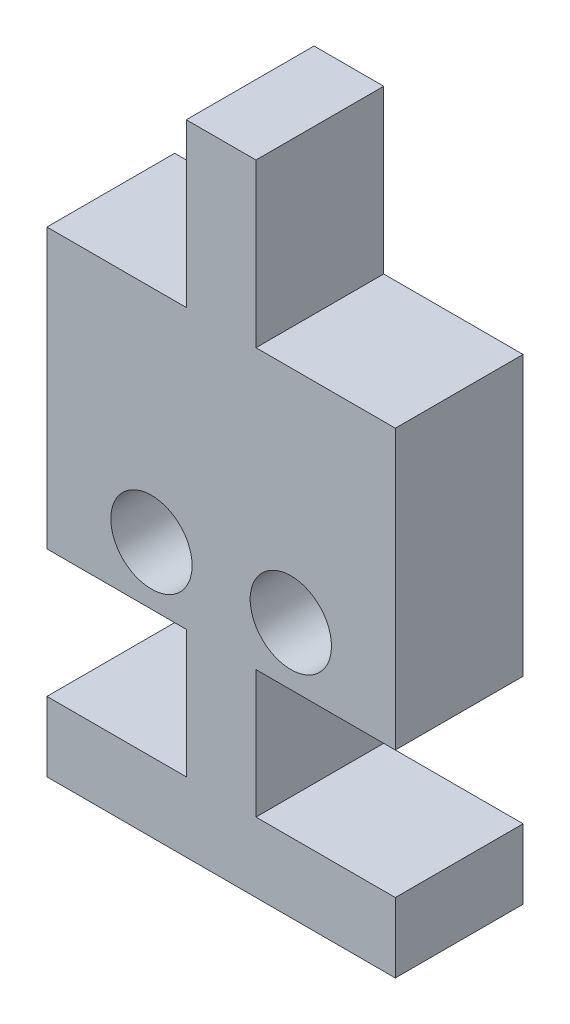
ISO-10303-21;
HEADER;
FILE_DESCRIPTION(('STEP AP214'),'2;1');
FILE_NAME('part.step','',(''),(''),'','','');
FILE_SCHEMA(('AUTOMOTIVE_DESIGN { 1 0 10303 214 1 1 1 1 }'));
ENDSEC;
DATA;
#1=APPLICATION_CONTEXT('core data for automotive mechanical design processes');
#2=APPLICATION_PROTOCOL_DEFINITION('international standard','automotive_design',2000,#1);
#3=PRODUCT_CONTEXT('',#1,'mechanical');
#4=PRODUCT('Part','Part','',(#3));
#5=PRODUCT_RELATED_PRODUCT_CATEGORY('part','',(#4));
#6=PRODUCT_DEFINITION_FORMATION('','',#4);
#7=PRODUCT_DEFINITION_CONTEXT('part definition',#1,'design');
#8=PRODUCT_DEFINITION('design','',#6,#7);
#9=PRODUCT_DEFINITION_SHAPE('','',#8);
#10=(LENGTH_UNIT() NAMED_UNIT(*) SI_UNIT(.MILLI.,.METRE.));
#11=(NAMED_UNIT(*) PLANE_ANGLE_UNIT() SI_UNIT($,.RADIAN.));
#12=(NAMED_UNIT(*) SI_UNIT($,.STERADIAN.) SOLID_ANGLE_UNIT());
#13=UNCERTAINTY_MEASURE_WITH_UNIT(LENGTH_MEASURE(1.E-05),#10,'distance_accuracy_value','');
#14=(GEOMETRIC_REPRESENTATION_CONTEXT(3) GLOBAL_UNCERTAINTY_ASSIGNED_CONTEXT((#13)) GLOBAL_UNIT_ASSIGNED_CONTEXT((#10,
#11,#12)) REPRESENTATION_CONTEXT('',''));
#15=CARTESIAN_POINT('',(0.,0.,0.));
#16=DIRECTION('',(0.,0.,1.));
#17=DIRECTION('',(1.,0.,0.));
#18=AXIS2_PLACEMENT_3D('',#15,#16,#17);
#19=CARTESIAN_POINT('',(-1.5,-6.99999999999999,5.5));
#20=DIRECTION('',(1.,0.,0.));
#21=DIRECTION('',(0.,1.,0.));
#22=AXIS2_PLACEMENT_3D('',#19,#20,#21);
#23=PLANE('',#22);
#24=DIRECTION('',(0.,-1.,0.));
#25=VECTOR('',#24,1.);
#26=CARTESIAN_POINT('',(-1.5,-6.99999999999999,0.));
#27=LINE('',#26,#25);
#28=CARTESIAN_POINT('',(-1.5,0.,0.));
#29=VERTEX_POINT('',#28);
#30=CARTESIAN_POINT('',(-1.5,-6.99999999999999,0.));
#31=VERTEX_POINT('',#30);
#32=EDGE_CURVE('E177',#29,#31,#27,.T.);
#33=ORIENTED_EDGE('',*,*,#32,.T.);
#34=DIRECTION('',(0.,0.,-1.));
#35=VECTOR('',#34,1.);
#36=CARTESIAN_POINT('',(-1.5,-6.99999999999999,5.5));
#37=LINE('',#36,#35);
#38=CARTESIAN_POINT('',(-1.5,-6.99999999999999,5.5));
#39=VERTEX_POINT('',#38);
#40=EDGE_CURVE('E11',#39,#31,#37,.T.);
#41=ORIENTED_EDGE('',*,*,#40,.F.);
#42=DIRECTION('',(0.,-1.,0.));
#43=VECTOR('',#42,1.);
#44=CARTESIAN_POINT('',(-1.5,-6.99999999999999,5.5));
#45=LINE('',#44,#43);
#46=CARTESIAN_POINT('',(-1.5,0.,5.5));
#47=VERTEX_POINT('',#46);
#48=EDGE_CURVE('E208',#47,#39,#45,.T.);
#49=ORIENTED_EDGE('',*,*,#48,.F.);
#50=DIRECTION('',(0.,0.,-1.));
#51=VECTOR('',#50,1.);
#52=CARTESIAN_POINT('',(-1.5,0.,5.5));
#53=LINE('',#52,#51);
#54=EDGE_CURVE('E173',#47,#29,#53,.T.);
#55=ORIENTED_EDGE('',*,*,#54,.T.);
#56=EDGE_LOOP('',(#33,#41,#49,#55));
#57=FACE_BOUND('',#56,.T.);
#58=ADVANCED_FACE('F33',(#57),#23,.F.);
#59=CARTESIAN_POINT('',(-7.5,-7.,5.5));
#60=DIRECTION('',(0.,-1.,0.));
#61=DIRECTION('',(1.,0.,0.));
#62=AXIS2_PLACEMENT_3D('',#59,#60,#61);
#63=PLANE('',#62);
#64=DIRECTION('',(-1.,0.,0.));
#65=VECTOR('',#64,1.);
#66=CARTESIAN_POINT('',(-7.5,-7.,0.));
#67=LINE('',#66,#65);
#68=CARTESIAN_POINT('',(-7.5,-7.,0.));
#69=VERTEX_POINT('',#68);
#70=EDGE_CURVE('E180',#31,#69,#67,.T.);
#71=ORIENTED_EDGE('',*,*,#70,.T.);
#72=DIRECTION('',(0.,0.,-1.));
#73=VECTOR('',#72,1.);
#74=CARTESIAN_POINT('',(-7.5,-7.,5.5));
#75=LINE('',#74,#73);
#76=CARTESIAN_POINT('',(-7.5,-7.,5.5));
#77=VERTEX_POINT('',#76);
#78=EDGE_CURVE('E41',#77,#69,#75,.T.);
#79=ORIENTED_EDGE('',*,*,#78,.F.);
#80=DIRECTION('',(-1.,0.,0.));
#81=VECTOR('',#80,1.);
#82=CARTESIAN_POINT('',(-7.5,-7.,5.5));
#83=LINE('',#82,#81);
#84=EDGE_CURVE('E116',#39,#77,#83,.T.);
#85=ORIENTED_EDGE('',*,*,#84,.F.);
#86=ORIENTED_EDGE('',*,*,#40,.T.);
#87=EDGE_LOOP('',(#71,#79,#85,#86));
#88=FACE_BOUND('',#87,.T.);
#89=ADVANCED_FACE('F308',(#88),#63,.F.);
#90=CARTESIAN_POINT('',(-7.5,-7.,5.5));
#91=DIRECTION('',(1.,0.,0.));
#92=DIRECTION('',(0.,1.,0.));
#93=AXIS2_PLACEMENT_3D('',#90,#91,#92);
#94=PLANE('',#93);
#95=DIRECTION('',(0.,-1.,0.));
#96=VECTOR('',#95,1.);
#97=CARTESIAN_POINT('',(-7.5,-7.,0.));
#98=LINE('',#97,#96);
#99=CARTESIAN_POINT('',(-7.5,-19.,0.));
#100=VERTEX_POINT('',#99);
#101=EDGE_CURVE('E183',#69,#100,#98,.T.);
#102=ORIENTED_EDGE('',*,*,#101,.T.);
#103=DIRECTION('',(0.,0.,-1.));
#104=VECTOR('',#103,1.);
#105=CARTESIAN_POINT('',(-7.5,-19.,5.5));
#106=LINE('',#105,#104);
#107=CARTESIAN_POINT('',(-7.5,-19.,5.5));
#108=VERTEX_POINT('',#107);
#109=EDGE_CURVE('E239',#108,#100,#106,.T.);
#110=ORIENTED_EDGE('',*,*,#109,.F.);
#111=DIRECTION('',(0.,-1.,0.));
#112=VECTOR('',#111,1.);
#113=CARTESIAN_POINT('',(-7.5,-7.,5.5));
#114=LINE('',#113,#112);
#115=EDGE_CURVE('E247',#77,#108,#114,.T.);
#116=ORIENTED_EDGE('',*,*,#115,.F.);
#117=ORIENTED_EDGE('',*,*,#78,.T.);
#118=EDGE_LOOP('',(#102,#110,#116,#117));
#119=FACE_BOUND('',#118,.T.);
#120=ADVANCED_FACE('F245',(#119),#94,.F.);
#121=CARTESIAN_POINT('',(-7.5,-19.,5.5));
#122=DIRECTION('',(0.,1.,0.));
#123=DIRECTION('',(-1.,0.,0.));
#124=AXIS2_PLACEMENT_3D('',#121,#122,#123);
#125=PLANE('',#124);
#126=DIRECTION('',(1.,0.,0.));
#127=VECTOR('',#126,1.);
#128=CARTESIAN_POINT('',(-7.5,-19.,0.));
#129=LINE('',#128,#127);
#130=CARTESIAN_POINT('',(-1.5,-19.,0.));
#131=VERTEX_POINT('',#130);
#132=EDGE_CURVE('E185',#100,#131,#129,.T.);
#133=ORIENTED_EDGE('',*,*,#132,.T.);
#134=DIRECTION('',(0.,0.,-1.));
#135=VECTOR('',#134,1.);
#136=CARTESIAN_POINT('',(-1.5,-19.,5.5));
#137=LINE('',#136,#135);
#138=CARTESIAN_POINT('',(-1.5,-19.,5.5));
#139=VERTEX_POINT('',#138);
#140=EDGE_CURVE('E236',#139,#131,#137,.T.);
#141=ORIENTED_EDGE('',*,*,#140,.F.);
#142=DIRECTION('',(1.,0.,0.));
#143=VECTOR('',#142,1.);
#144=CARTESIAN_POINT('',(-7.5,-19.,5.5));
#145=LINE('',#144,#143);
#146=EDGE_CURVE('E265',#108,#139,#145,.T.);
#147=ORIENTED_EDGE('',*,*,#146,.F.);
#148=ORIENTED_EDGE('',*,*,#109,.T.);
#149=EDGE_LOOP('',(#133,#141,#147,#148));
#150=FACE_BOUND('',#149,.T.);
#151=ADVANCED_FACE('F256',(#150),#125,.F.);
#152=CARTESIAN_POINT('',(-1.5,-24.5,5.5));
#153=DIRECTION('',(1.,0.,0.));
#154=DIRECTION('',(0.,1.,0.));
#155=AXIS2_PLACEMENT_3D('',#152,#153,#154);
#156=PLANE('',#155);
#157=DIRECTION('',(0.,-1.,0.));
#158=VECTOR('',#157,1.);
#159=CARTESIAN_POINT('',(-1.5,-24.5,0.));
#160=LINE('',#159,#158);
#161=CARTESIAN_POINT('',(-1.5,-24.5,0.));
#162=VERTEX_POINT('',#161);
#163=EDGE_CURVE('E187',#131,#162,#160,.T.);
#164=ORIENTED_EDGE('',*,*,#163,.T.);
#165=DIRECTION('',(0.,0.,-1.));
#166=VECTOR('',#165,1.);
#167=CARTESIAN_POINT('',(-1.5,-24.5,5.5));
#168=LINE('',#167,#166);
#169=CARTESIAN_POINT('',(-1.5,-24.5,5.5));
#170=VERTEX_POINT('',#169);
#171=EDGE_CURVE('E233',#170,#162,#168,.T.);
#172=ORIENTED_EDGE('',*,*,#171,.F.);
#173=DIRECTION('',(0.,-1.,0.));
#174=VECTOR('',#173,1.);
#175=CARTESIAN_POINT('',(-1.5,-24.5,5.5));
#176=LINE('',#175,#174);
#177=EDGE_CURVE('E262',#139,#170,#176,.T.);
#178=ORIENTED_EDGE('',*,*,#177,.F.);
#179=ORIENTED_EDGE('',*,*,#140,.T.);
#180=EDGE_LOOP('',(#164,#172,#178,#179));
#181=FACE_BOUND('',#180,.T.);
#182=ADVANCED_FACE('F260',(#181),#156,.F.);
#183=CARTESIAN_POINT('',(-7.50000000000001,-24.5,5.5));
#184=DIRECTION('',(0.,-1.,0.));
#185=DIRECTION('',(1.,0.,0.));
#186=AXIS2_PLACEMENT_3D('',#183,#184,#185);
#187=PLANE('',#186);
#188=DIRECTION('',(-1.,0.,0.));
#189=VECTOR('',#188,1.);
#190=CARTESIAN_POINT('',(-7.50000000000001,-24.5,0.));
#191=LINE('',#190,#189);
#192=CARTESIAN_POINT('',(-7.50000000000001,-24.5,0.));
#193=VERTEX_POINT('',#192);
#194=EDGE_CURVE('E189',#162,#193,#191,.T.);
#195=ORIENTED_EDGE('',*,*,#194,.T.);
#196=DIRECTION('',(0.,0.,-1.));
#197=VECTOR('',#196,1.);
#198=CARTESIAN_POINT('',(-7.50000000000001,-24.5,5.5));
#199=LINE('',#198,#197);
#200=CARTESIAN_POINT('',(-7.50000000000001,-24.5,5.5));
#201=VERTEX_POINT('',#200);
#202=EDGE_CURVE('E230',#201,#193,#199,.T.);
#203=ORIENTED_EDGE('',*,*,#202,.F.);
#204=DIRECTION('',(-1.,0.,0.));
#205=VECTOR('',#204,1.);
#206=CARTESIAN_POINT('',(-7.50000000000001,-24.5,5.5));
#207=LINE('',#206,#205);
#208=EDGE_CURVE('E264',#170,#201,#207,.T.);
#209=ORIENTED_EDGE('',*,*,#208,.F.);
#210=ORIENTED_EDGE('',*,*,#171,.T.);
#211=EDGE_LOOP('',(#195,#203,#209,#210));
#212=FACE_BOUND('',#211,.T.);
#213=ADVANCED_FACE('F321',(#212),#187,.F.);
#214=CARTESIAN_POINT('',(-7.50000000000001,-24.5,5.5));
#215=DIRECTION('',(1.,0.,0.));
#216=DIRECTION('',(0.,0.,-1.));
#217=AXIS2_PLACEMENT_3D('',#214,#215,#216);
#218=PLANE('',#217);
#219=DIRECTION('',(0.,-1.,0.));
#220=VECTOR('',#219,1.);
#221=CARTESIAN_POINT('',(-7.50000000000001,-24.5,0.));
#222=LINE('',#221,#220);
#223=CARTESIAN_POINT('',(-7.50000000000001,-27.5,0.));
#224=VERTEX_POINT('',#223);
#225=EDGE_CURVE('E191',#193,#224,#222,.T.);
#226=ORIENTED_EDGE('',*,*,#225,.T.);
#227=DIRECTION('',(0.,0.,-1.));
#228=VECTOR('',#227,1.);
#229=CARTESIAN_POINT('',(-7.50000000000001,-27.5,5.5));
#230=LINE('',#229,#228);
#231=CARTESIAN_POINT('',(-7.50000000000001,-27.5,5.5));
#232=VERTEX_POINT('',#231);
#233=EDGE_CURVE('E227',#232,#224,#230,.T.);
#234=ORIENTED_EDGE('',*,*,#233,.F.);
#235=DIRECTION('',(0.,-1.,0.));
#236=VECTOR('',#235,1.);
#237=CARTESIAN_POINT('',(-7.50000000000001,-24.5,5.5));
#238=LINE('',#237,#236);
#239=EDGE_CURVE('E267',#201,#232,#238,.T.);
#240=ORIENTED_EDGE('',*,*,#239,.F.);
#241=ORIENTED_EDGE('',*,*,#202,.T.);
#242=EDGE_LOOP('',(#226,#234,#240,#241));
#243=FACE_BOUND('',#242,.T.);
#244=ADVANCED_FACE('F324',(#243),#218,.F.);
#245=CARTESIAN_POINT('',(-7.50000000000001,-27.5,5.5));
#246=DIRECTION('',(0.,1.,0.));
#247=DIRECTION('',(-1.,0.,0.));
#248=AXIS2_PLACEMENT_3D('',#245,#246,#247);
#249=PLANE('',#248);
#250=DIRECTION('',(1.,0.,0.));
#251=VECTOR('',#250,1.);
#252=CARTESIAN_POINT('',(-7.50000000000001,-27.5,0.));
#253=LINE('',#252,#251);
#254=CARTESIAN_POINT('',(7.49999999999999,-27.5,0.));
#255=VERTEX_POINT('',#254);
#256=EDGE_CURVE('E193',#224,#255,#253,.T.);
#257=ORIENTED_EDGE('',*,*,#256,.T.);
#258=DIRECTION('',(0.,0.,-1.));
#259=VECTOR('',#258,1.);
#260=CARTESIAN_POINT('',(7.49999999999999,-27.5,5.5));
#261=LINE('',#260,#259);
#262=CARTESIAN_POINT('',(7.49999999999999,-27.5,5.5));
#263=VERTEX_POINT('',#262);
#264=EDGE_CURVE('E224',#263,#255,#261,.T.);
#265=ORIENTED_EDGE('',*,*,#264,.F.);
#266=DIRECTION('',(1.,0.,0.));
#267=VECTOR('',#266,1.);
#268=CARTESIAN_POINT('',(-7.50000000000001,-27.5,5.5));
#269=LINE('',#268,#267);
#270=EDGE_CURVE('E273',#232,#263,#269,.T.);
#271=ORIENTED_EDGE('',*,*,#270,.F.);
#272=ORIENTED_EDGE('',*,*,#233,.T.);
#273=EDGE_LOOP('',(#257,#265,#271,#272));
#274=FACE_BOUND('',#273,.T.);
#275=ADVANCED_FACE('F328',(#274),#249,.F.);
#276=CARTESIAN_POINT('',(7.49999999999999,-24.5,5.5));
#277=DIRECTION('',(-1.,0.,0.));
#278=DIRECTION('',(0.,0.,1.));
#279=AXIS2_PLACEMENT_3D('',#276,#277,#278);
#280=PLANE('',#279);
#281=DIRECTION('',(0.,1.,0.));
#282=VECTOR('',#281,1.);
#283=CARTESIAN_POINT('',(7.49999999999999,-24.5,0.));
#284=LINE('',#283,#282);
#285=CARTESIAN_POINT('',(7.49999999999999,-24.5,0.));
#286=VERTEX_POINT('',#285);
#287=EDGE_CURVE('E195',#255,#286,#284,.T.);
#288=ORIENTED_EDGE('',*,*,#287,.T.);
#289=DIRECTION('',(0.,0.,-1.));
#290=VECTOR('',#289,1.);
#291=CARTESIAN_POINT('',(7.49999999999999,-24.5,5.5));
#292=LINE('',#291,#290);
#293=CARTESIAN_POINT('',(7.49999999999999,-24.5,5.5));
#294=VERTEX_POINT('',#293);
#295=EDGE_CURVE('E221',#294,#286,#292,.T.);
#296=ORIENTED_EDGE('',*,*,#295,.F.);
#297=DIRECTION('',(0.,1.,0.));
#298=VECTOR('',#297,1.);
#299=CARTESIAN_POINT('',(7.49999999999999,-24.5,5.5));
#300=LINE('',#299,#298);
#301=EDGE_CURVE('E275',#263,#294,#300,.T.);
#302=ORIENTED_EDGE('',*,*,#301,.F.);
#303=ORIENTED_EDGE('',*,*,#264,.T.);
#304=EDGE_LOOP('',(#288,#296,#302,#303));
#305=FACE_BOUND('',#304,.T.);
#306=ADVANCED_FACE('F332',(#305),#280,.F.);
#307=CARTESIAN_POINT('',(1.5,-24.5,5.5));
#308=DIRECTION('',(0.,-1.,0.));
#309=DIRECTION('',(1.,0.,0.));
#310=AXIS2_PLACEMENT_3D('',#307,#308,#309);
#311=PLANE('',#310);
#312=DIRECTION('',(-1.,0.,0.));
#313=VECTOR('',#312,1.);
#314=CARTESIAN_POINT('',(1.5,-24.5,0.));
#315=LINE('',#314,#313);
#316=CARTESIAN_POINT('',(1.5,-24.5,0.));
#317=VERTEX_POINT('',#316);
#318=EDGE_CURVE('E197',#286,#317,#315,.T.);
#319=ORIENTED_EDGE('',*,*,#318,.T.);
#320=DIRECTION('',(0.,0.,-1.));
#321=VECTOR('',#320,1.);
#322=CARTESIAN_POINT('',(1.5,-24.5,5.5));
#323=LINE('',#322,#321);
#324=CARTESIAN_POINT('',(1.5,-24.5,5.5));
#325=VERTEX_POINT('',#324);
#326=EDGE_CURVE('E218',#325,#317,#323,.T.);
#327=ORIENTED_EDGE('',*,*,#326,.F.);
#328=DIRECTION('',(-1.,0.,0.));
#329=VECTOR('',#328,1.);
#330=CARTESIAN_POINT('',(1.5,-24.5,5.5));
#331=LINE('',#330,#329);
#332=EDGE_CURVE('E277',#294,#325,#331,.T.);
#333=ORIENTED_EDGE('',*,*,#332,.F.);
#334=ORIENTED_EDGE('',*,*,#295,.T.);
#335=EDGE_LOOP('',(#319,#327,#333,#334));
#336=FACE_BOUND('',#335,.T.);
#337=ADVANCED_FACE('F336',(#336),#311,.F.);
#338=CARTESIAN_POINT('',(1.5,-24.5,5.5));
#339=DIRECTION('',(-1.,0.,0.));
#340=DIRECTION('',(0.,0.,1.));
#341=AXIS2_PLACEMENT_3D('',#338,#339,#340);
#342=PLANE('',#341);
#343=DIRECTION('',(0.,1.,0.));
#344=VECTOR('',#343,1.);
#345=CARTESIAN_POINT('',(1.5,-24.5,0.));
#346=LINE('',#345,#344);
#347=CARTESIAN_POINT('',(1.5,-19.,0.));
#348=VERTEX_POINT('',#347);
#349=EDGE_CURVE('E199',#317,#348,#346,.T.);
#350=ORIENTED_EDGE('',*,*,#349,.T.);
#351=DIRECTION('',(0.,0.,-1.));
#352=VECTOR('',#351,1.);
#353=CARTESIAN_POINT('',(1.5,-19.,5.5));
#354=LINE('',#353,#352);
#355=CARTESIAN_POINT('',(1.5,-19.,5.5));
#356=VERTEX_POINT('',#355);
#357=EDGE_CURVE('E215',#356,#348,#354,.T.);
#358=ORIENTED_EDGE('',*,*,#357,.F.);
#359=DIRECTION('',(0.,1.,0.));
#360=VECTOR('',#359,1.);
#361=CARTESIAN_POINT('',(1.5,-24.5,5.5));
#362=LINE('',#361,#360);
#363=EDGE_CURVE('E279',#325,#356,#362,.T.);
#364=ORIENTED_EDGE('',*,*,#363,.F.);
#365=ORIENTED_EDGE('',*,*,#326,.T.);
#366=EDGE_LOOP('',(#350,#358,#364,#365));
#367=FACE_BOUND('',#366,.T.);
#368=ADVANCED_FACE('F340',(#367),#342,.F.);
#369=CARTESIAN_POINT('',(1.5,-19.,5.5));
#370=DIRECTION('',(0.,1.,0.));
#371=DIRECTION('',(-1.,0.,0.));
#372=AXIS2_PLACEMENT_3D('',#369,#370,#371);
#373=PLANE('',#372);
#374=DIRECTION('',(1.,0.,0.));
#375=VECTOR('',#374,1.);
#376=CARTESIAN_POINT('',(1.5,-19.,0.));
#377=LINE('',#376,#375);
#378=CARTESIAN_POINT('',(7.5,-19.,0.));
#379=VERTEX_POINT('',#378);
#380=EDGE_CURVE('E201',#348,#379,#377,.T.);
#381=ORIENTED_EDGE('',*,*,#380,.T.);
#382=DIRECTION('',(0.,0.,-1.));
#383=VECTOR('',#382,1.);
#384=CARTESIAN_POINT('',(7.5,-19.,5.5));
#385=LINE('',#384,#383);
#386=CARTESIAN_POINT('',(7.5,-19.,5.5));
#387=VERTEX_POINT('',#386);
#388=EDGE_CURVE('E212',#387,#379,#385,.T.);
#389=ORIENTED_EDGE('',*,*,#388,.F.);
#390=DIRECTION('',(1.,0.,0.));
#391=VECTOR('',#390,1.);
#392=CARTESIAN_POINT('',(1.5,-19.,5.5));
#393=LINE('',#392,#391);
#394=EDGE_CURVE('E281',#356,#387,#393,.T.);
#395=ORIENTED_EDGE('',*,*,#394,.F.);
#396=ORIENTED_EDGE('',*,*,#357,.T.);
#397=EDGE_LOOP('',(#381,#389,#395,#396));
#398=FACE_BOUND('',#397,.T.);
#399=ADVANCED_FACE('F287',(#398),#373,.F.);
#400=CARTESIAN_POINT('',(7.5,-6.99999999999999,5.5));
#401=DIRECTION('',(-1.,0.,0.));
#402=DIRECTION('',(0.,-1.,0.));
#403=AXIS2_PLACEMENT_3D('',#400,#401,#402);
#404=PLANE('',#403);
#405=DIRECTION('',(0.,1.,0.));
#406=VECTOR('',#405,1.);
#407=CARTESIAN_POINT('',(7.5,-6.99999999999999,0.));
#408=LINE('',#407,#406);
#409=CARTESIAN_POINT('',(7.5,-6.99999999999999,0.));
#410=VERTEX_POINT('',#409);
#411=EDGE_CURVE('E203',#379,#410,#408,.T.);
#412=ORIENTED_EDGE('',*,*,#411,.T.);
#413=DIRECTION('',(0.,0.,-1.));
#414=VECTOR('',#413,1.);
#415=CARTESIAN_POINT('',(7.5,-6.99999999999999,5.5));
#416=LINE('',#415,#414);
#417=CARTESIAN_POINT('',(7.5,-6.99999999999999,5.5));
#418=VERTEX_POINT('',#417);
#419=EDGE_CURVE('E168',#418,#410,#416,.T.);
#420=ORIENTED_EDGE('',*,*,#419,.F.);
#421=DIRECTION('',(0.,1.,0.));
#422=VECTOR('',#421,1.);
#423=CARTESIAN_POINT('',(7.5,-6.99999999999999,5.5));
#424=LINE('',#423,#422);
#425=EDGE_CURVE('E159',#387,#418,#424,.T.);
#426=ORIENTED_EDGE('',*,*,#425,.F.);
#427=ORIENTED_EDGE('',*,*,#388,.T.);
#428=EDGE_LOOP('',(#412,#420,#426,#427));
#429=FACE_BOUND('',#428,.T.);
#430=ADVANCED_FACE('F291',(#429),#404,.F.);
#431=CARTESIAN_POINT('',(1.5,-6.99999999999999,5.5));
#432=DIRECTION('',(0.,-1.,0.));
#433=DIRECTION('',(1.,0.,0.));
#434=AXIS2_PLACEMENT_3D('',#431,#432,#433);
#435=PLANE('',#434);
#436=DIRECTION('',(-1.,0.,0.));
#437=VECTOR('',#436,1.);
#438=CARTESIAN_POINT('',(1.5,-6.99999999999999,0.));
#439=LINE('',#438,#437);
#440=CARTESIAN_POINT('',(1.5,-6.99999999999999,0.));
#441=VERTEX_POINT('',#440);
#442=EDGE_CURVE('E167',#410,#441,#439,.T.);
#443=ORIENTED_EDGE('',*,*,#442,.T.);
#444=DIRECTION('',(0.,0.,-1.));
#445=VECTOR('',#444,1.);
#446=CARTESIAN_POINT('',(1.5,-6.99999999999999,5.5));
#447=LINE('',#446,#445);
#448=CARTESIAN_POINT('',(1.5,-6.99999999999999,5.5));
#449=VERTEX_POINT('',#448);
#450=EDGE_CURVE('E164',#449,#441,#447,.T.);
#451=ORIENTED_EDGE('',*,*,#450,.F.);
#452=DIRECTION('',(-1.,0.,0.));
#453=VECTOR('',#452,1.);
#454=CARTESIAN_POINT('',(1.5,-6.99999999999999,5.5));
#455=LINE('',#454,#453);
#456=EDGE_CURVE('E153',#418,#449,#455,.T.);
#457=ORIENTED_EDGE('',*,*,#456,.F.);
#458=ORIENTED_EDGE('',*,*,#419,.T.);
#459=EDGE_LOOP('',(#443,#451,#457,#458));
#460=FACE_BOUND('',#459,.T.);
#461=ADVANCED_FACE('F165',(#460),#435,.F.);
#462=CARTESIAN_POINT('',(1.5,-6.99999999999999,5.5));
#463=DIRECTION('',(-1.,0.,0.));
#464=DIRECTION('',(0.,-1.,0.));
#465=AXIS2_PLACEMENT_3D('',#462,#463,#464);
#466=PLANE('',#465);
#467=DIRECTION('',(0.,1.,0.));
#468=VECTOR('',#467,1.);
#469=CARTESIAN_POINT('',(1.5,-6.99999999999999,0.));
#470=LINE('',#469,#468);
#471=CARTESIAN_POINT('',(1.5,0.,0.));
#472=VERTEX_POINT('',#471);
#473=EDGE_CURVE('E102',#441,#472,#470,.T.);
#474=ORIENTED_EDGE('',*,*,#473,.T.);
#475=DIRECTION('',(0.,0.,-1.));
#476=VECTOR('',#475,1.);
#477=CARTESIAN_POINT('',(1.5,0.,5.5));
#478=LINE('',#477,#476);
#479=CARTESIAN_POINT('',(1.5,0.,5.5));
#480=VERTEX_POINT('',#479);
#481=EDGE_CURVE('E169',#480,#472,#478,.T.);
#482=ORIENTED_EDGE('',*,*,#481,.F.);
#483=DIRECTION('',(0.,1.,0.));
#484=VECTOR('',#483,1.);
#485=CARTESIAN_POINT('',(1.5,-6.99999999999999,5.5));
#486=LINE('',#485,#484);
#487=EDGE_CURVE('E157',#449,#480,#486,.T.);
#488=ORIENTED_EDGE('',*,*,#487,.F.);
#489=ORIENTED_EDGE('',*,*,#450,.T.);
#490=EDGE_LOOP('',(#474,#482,#488,#489));
#491=FACE_BOUND('',#490,.T.);
#492=ADVANCED_FACE('F171',(#491),#466,.F.);
#493=CARTESIAN_POINT('',(1.5,0.,5.5));
#494=DIRECTION('',(0.,-1.,0.));
#495=DIRECTION('',(0.,0.,-1.));
#496=AXIS2_PLACEMENT_3D('',#493,#494,#495);
#497=PLANE('',#496);
#498=DIRECTION('',(-1.,0.,0.));
#499=VECTOR('',#498,1.);
#500=CARTESIAN_POINT('',(1.5,0.,0.));
#501=LINE('',#500,#499);
#502=EDGE_CURVE('E108',#472,#29,#501,.T.);
#503=ORIENTED_EDGE('',*,*,#502,.T.);
#504=ORIENTED_EDGE('',*,*,#54,.F.);
#505=DIRECTION('',(-1.,0.,0.));
#506=VECTOR('',#505,1.);
#507=CARTESIAN_POINT('',(1.5,0.,5.5));
#508=LINE('',#507,#506);
#509=EDGE_CURVE('E49',#480,#47,#508,.T.);
#510=ORIENTED_EDGE('',*,*,#509,.F.);
#511=ORIENTED_EDGE('',*,*,#481,.T.);
#512=EDGE_LOOP('',(#503,#504,#510,#511));
#513=FACE_BOUND('',#512,.T.);
#514=ADVANCED_FACE('F295',(#513),#497,.F.);
#515=CARTESIAN_POINT('',(0.,0.,5.5));
#516=DIRECTION('',(0.,0.,1.));
#517=DIRECTION('',(1.,0.,0.));
#518=AXIS2_PLACEMENT_3D('',#515,#516,#517);
#519=PLANE('',#518);
#520=CARTESIAN_POINT('',(-3.,-16.5,5.5));
#521=DIRECTION('',(0.,0.,1.));
#522=DIRECTION('',(1.,0.,0.));
#523=AXIS2_PLACEMENT_3D('',#520,#521,#522);
#524=CIRCLE('',#523,1.75);
#525=CARTESIAN_POINT('',(-1.25,-16.5,5.5));
#526=VERTEX_POINT('',#525);
#527=EDGE_CURVE('E400',#526,#526,#524,.T.);
#528=ORIENTED_EDGE('',*,*,#527,.F.);
#529=EDGE_LOOP('',(#528));
#530=FACE_BOUND('',#529,.T.);
#531=CARTESIAN_POINT('',(3.,-16.5,5.5));
#532=DIRECTION('',(0.,0.,1.));
#533=DIRECTION('',(1.,0.,0.));
#534=AXIS2_PLACEMENT_3D('',#531,#532,#533);
#535=CIRCLE('',#534,1.75);
#536=CARTESIAN_POINT('',(4.75,-16.5,5.5));
#537=VERTEX_POINT('',#536);
#538=EDGE_CURVE('E405',#537,#537,#535,.T.);
#539=ORIENTED_EDGE('',*,*,#538,.F.);
#540=EDGE_LOOP('',(#539));
#541=FACE_BOUND('',#540,.T.);
#542=ORIENTED_EDGE('',*,*,#48,.T.);
#543=ORIENTED_EDGE('',*,*,#84,.T.);
#544=ORIENTED_EDGE('',*,*,#115,.T.);
#545=ORIENTED_EDGE('',*,*,#146,.T.);
#546=ORIENTED_EDGE('',*,*,#177,.T.);
#547=ORIENTED_EDGE('',*,*,#208,.T.);
#548=ORIENTED_EDGE('',*,*,#239,.T.);
#549=ORIENTED_EDGE('',*,*,#270,.T.);
#550=ORIENTED_EDGE('',*,*,#301,.T.);
#551=ORIENTED_EDGE('',*,*,#332,.T.);
#552=ORIENTED_EDGE('',*,*,#363,.T.);
#553=ORIENTED_EDGE('',*,*,#394,.T.);
#554=ORIENTED_EDGE('',*,*,#425,.T.);
#555=ORIENTED_EDGE('',*,*,#456,.T.);
#556=ORIENTED_EDGE('',*,*,#487,.T.);
#557=ORIENTED_EDGE('',*,*,#509,.T.);
#558=EDGE_LOOP('',(#542,#543,#544,#545,#546,#547,#548,#549,#550,#551,#552,#553,#554,#555,#556,#557));
#559=FACE_BOUND('',#558,.T.);
#560=ADVANCED_FACE('F155',(#530,#541,#559),#519,.T.);
#561=CARTESIAN_POINT('',(0.,0.,0.));
#562=DIRECTION('',(0.,0.,1.));
#563=DIRECTION('',(1.,0.,0.));
#564=AXIS2_PLACEMENT_3D('',#561,#562,#563);
#565=PLANE('',#564);
#566=CARTESIAN_POINT('',(-3.,-16.5,0.));
#567=DIRECTION('',(0.,0.,1.));
#568=DIRECTION('',(1.,0.,0.));
#569=AXIS2_PLACEMENT_3D('',#566,#567,#568);
#570=CIRCLE('',#569,1.75);
#571=CARTESIAN_POINT('',(-1.25,-16.5,0.));
#572=VERTEX_POINT('',#571);
#573=EDGE_CURVE('E181',#572,#572,#570,.T.);
#574=ORIENTED_EDGE('',*,*,#573,.T.);
#575=EDGE_LOOP('',(#574));
#576=FACE_BOUND('',#575,.T.);
#577=CARTESIAN_POINT('',(3.,-16.5,0.));
#578=DIRECTION('',(0.,0.,1.));
#579=DIRECTION('',(1.,0.,0.));
#580=AXIS2_PLACEMENT_3D('',#577,#578,#579);
#581=CIRCLE('',#580,1.75);
#582=CARTESIAN_POINT('',(4.75,-16.5,0.));
#583=VERTEX_POINT('',#582);
#584=EDGE_CURVE('E401',#583,#583,#581,.T.);
#585=ORIENTED_EDGE('',*,*,#584,.T.);
#586=EDGE_LOOP('',(#585));
#587=FACE_BOUND('',#586,.T.);
#588=ORIENTED_EDGE('',*,*,#32,.F.);
#589=ORIENTED_EDGE('',*,*,#502,.F.);
#590=ORIENTED_EDGE('',*,*,#473,.F.);
#591=ORIENTED_EDGE('',*,*,#442,.F.);
#592=ORIENTED_EDGE('',*,*,#411,.F.);
#593=ORIENTED_EDGE('',*,*,#380,.F.);
#594=ORIENTED_EDGE('',*,*,#349,.F.);
#595=ORIENTED_EDGE('',*,*,#318,.F.);
#596=ORIENTED_EDGE('',*,*,#287,.F.);
#597=ORIENTED_EDGE('',*,*,#256,.F.);
#598=ORIENTED_EDGE('',*,*,#225,.F.);
#599=ORIENTED_EDGE('',*,*,#194,.F.);
#600=ORIENTED_EDGE('',*,*,#163,.F.);
#601=ORIENTED_EDGE('',*,*,#132,.F.);
#602=ORIENTED_EDGE('',*,*,#101,.F.);
#603=ORIENTED_EDGE('',*,*,#70,.F.);
#604=EDGE_LOOP('',(#588,#589,#590,#591,#592,#593,#594,#595,#596,#597,#598,#599,#600,#601,#602,#603));
#605=FACE_BOUND('',#604,.T.);
#606=ADVANCED_FACE('F251',(#576,#587,#605),#565,.F.);
#607=CARTESIAN_POINT('',(3.,-16.5,0.));
#608=DIRECTION('',(0.,0.,1.));
#609=DIRECTION('',(1.,0.,0.));
#610=AXIS2_PLACEMENT_3D('',#607,#608,#609);
#611=CYLINDRICAL_SURFACE('',#610,1.75);
#612=ORIENTED_EDGE('',*,*,#584,.F.);
#613=EDGE_LOOP('',(#612));
#614=FACE_BOUND('',#613,.T.);
#615=ORIENTED_EDGE('',*,*,#538,.T.);
#616=EDGE_LOOP('',(#615));
#617=FACE_BOUND('',#616,.T.);
#618=ADVANCED_FACE('F373',(#614,#617),#611,.F.);
#619=CARTESIAN_POINT('',(-3.,-16.5,0.));
#620=DIRECTION('',(0.,0.,1.));
#621=DIRECTION('',(1.,0.,0.));
#622=AXIS2_PLACEMENT_3D('',#619,#620,#621);
#623=CYLINDRICAL_SURFACE('',#622,1.75);
#624=ORIENTED_EDGE('',*,*,#573,.F.);
#625=EDGE_LOOP('',(#624));
#626=FACE_BOUND('',#625,.T.);
#627=ORIENTED_EDGE('',*,*,#527,.T.);
#628=EDGE_LOOP('',(#627));
#629=FACE_BOUND('',#628,.T.);
#630=ADVANCED_FACE('F381',(#626,#629),#623,.F.);
#631=CLOSED_SHELL('',(#58,#89,#120,#151,#182,#213,#244,#275,#306,#337,#368,#399,#430,#461,#492,
#514,#560,#606,#618,#630));
#632=MANIFOLD_SOLID_BREP('B2',#631);
#633=ADVANCED_BREP_SHAPE_REPRESENTATION('',(#18,#632),#14);
#634=SHAPE_DEFINITION_REPRESENTATION(#9,#633);
ENDSEC;
END-ISO-10303-21;
